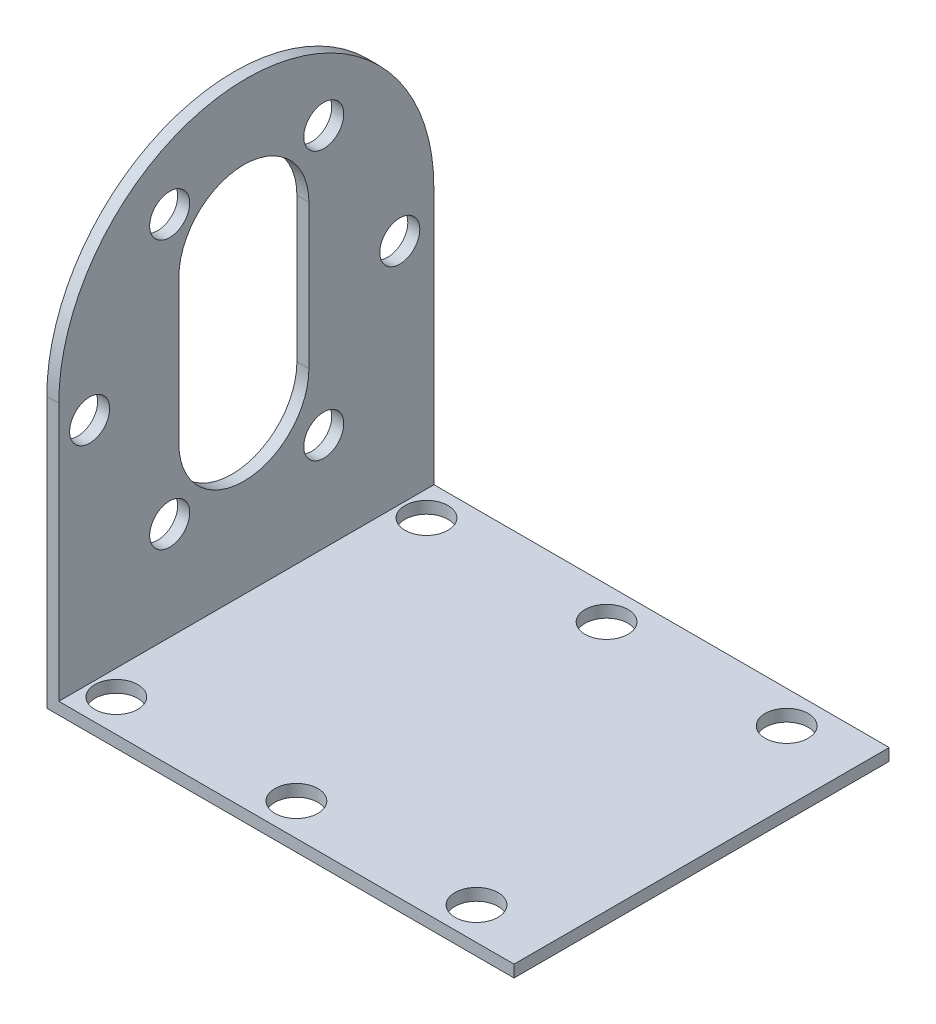
ISO-10303-21;
HEADER;
FILE_DESCRIPTION(('STEP AP214'),'2;1');
FILE_NAME('part.step','',(''),(''),'','','');
FILE_SCHEMA(('AUTOMOTIVE_DESIGN { 1 0 10303 214 1 1 1 1 }'));
ENDSEC;
DATA;
#1=APPLICATION_CONTEXT('core data for automotive mechanical design processes');
#2=APPLICATION_PROTOCOL_DEFINITION('international standard','automotive_design',2000,#1);
#3=PRODUCT_CONTEXT('',#1,'mechanical');
#4=PRODUCT('Part','Part','',(#3));
#5=PRODUCT_RELATED_PRODUCT_CATEGORY('part','',(#4));
#6=PRODUCT_DEFINITION_FORMATION('','',#4);
#7=PRODUCT_DEFINITION_CONTEXT('part definition',#1,'design');
#8=PRODUCT_DEFINITION('design','',#6,#7);
#9=PRODUCT_DEFINITION_SHAPE('','',#8);
#10=(LENGTH_UNIT() NAMED_UNIT(*) SI_UNIT(.MILLI.,.METRE.));
#11=(NAMED_UNIT(*) PLANE_ANGLE_UNIT() SI_UNIT($,.RADIAN.));
#12=(NAMED_UNIT(*) SI_UNIT($,.STERADIAN.) SOLID_ANGLE_UNIT());
#13=UNCERTAINTY_MEASURE_WITH_UNIT(LENGTH_MEASURE(1.E-05),#10,'distance_accuracy_value','');
#14=(GEOMETRIC_REPRESENTATION_CONTEXT(3) GLOBAL_UNCERTAINTY_ASSIGNED_CONTEXT((#13)) GLOBAL_UNIT_ASSIGNED_CONTEXT((#10,
#11,#12)) REPRESENTATION_CONTEXT('',''));
#15=CARTESIAN_POINT('',(0.,0.,0.));
#16=DIRECTION('',(0.,0.,1.));
#17=DIRECTION('',(1.,0.,0.));
#18=AXIS2_PLACEMENT_3D('',#15,#16,#17);
#19=CARTESIAN_POINT('',(0.,1.2,0.));
#20=DIRECTION('',(1.,0.,0.));
#21=DIRECTION('',(0.,0.,-1.));
#22=AXIS2_PLACEMENT_3D('',#19,#20,#21);
#23=PLANE('',#22);
#24=DIRECTION('',(0.,-1.,0.));
#25=VECTOR('',#24,1.);
#26=CARTESIAN_POINT('',(0.,0.,-37.481879160282));
#27=LINE('',#26,#25);
#28=CARTESIAN_POINT('',(0.,1.2,-37.481879160282));
#29=VERTEX_POINT('',#28);
#30=CARTESIAN_POINT('',(0.,0.,-37.481879160282));
#31=VERTEX_POINT('',#30);
#32=EDGE_CURVE('E11',#29,#31,#27,.T.);
#33=ORIENTED_EDGE('',*,*,#32,.F.);
#34=DIRECTION('',(0.,0.,1.));
#35=VECTOR('',#34,1.);
#36=CARTESIAN_POINT('',(0.,1.2,0.));
#37=LINE('',#36,#35);
#38=CARTESIAN_POINT('',(0.,1.2,-37.5));
#39=VERTEX_POINT('',#38);
#40=EDGE_CURVE('E111',#39,#29,#37,.T.);
#41=ORIENTED_EDGE('',*,*,#40,.F.);
#42=DIRECTION('',(0.,-1.,0.));
#43=VECTOR('',#42,1.);
#44=CARTESIAN_POINT('',(0.,1.2,-37.5));
#45=LINE('',#44,#43);
#46=CARTESIAN_POINT('',(0.,0.,-37.5));
#47=VERTEX_POINT('',#46);
#48=EDGE_CURVE('E168',#39,#47,#45,.T.);
#49=ORIENTED_EDGE('',*,*,#48,.T.);
#50=DIRECTION('',(0.,0.,1.));
#51=VECTOR('',#50,1.);
#52=CARTESIAN_POINT('',(0.,0.,0.));
#53=LINE('',#52,#51);
#54=EDGE_CURVE('E113',#47,#31,#53,.T.);
#55=ORIENTED_EDGE('',*,*,#54,.T.);
#56=EDGE_LOOP('',(#33,#41,#49,#55));
#57=FACE_BOUND('',#56,.T.);
#58=ADVANCED_FACE('F32',(#57),#23,.F.);
#59=CARTESIAN_POINT('',(0.,1.2,0.));
#60=DIRECTION('',(0.,-1.,0.));
#61=DIRECTION('',(0.,0.,-1.));
#62=AXIS2_PLACEMENT_3D('',#59,#60,#61);
#63=PLANE('',#62);
#64=ORIENTED_EDGE('',*,*,#40,.T.);
#65=CARTESIAN_POINT('',(0.,1.2,0.));
#66=VERTEX_POINT('',#65);
#67=EDGE_CURVE('E122',#29,#66,#37,.T.);
#68=ORIENTED_EDGE('',*,*,#67,.T.);
#69=DIRECTION('',(1.,0.,0.));
#70=VECTOR('',#69,1.);
#71=CARTESIAN_POINT('',(0.,1.2,0.));
#72=LINE('',#71,#70);
#73=CARTESIAN_POINT('',(45.5,1.2,0.));
#74=VERTEX_POINT('',#73);
#75=EDGE_CURVE('E126',#66,#74,#72,.T.);
#76=ORIENTED_EDGE('',*,*,#75,.T.);
#77=DIRECTION('',(0.,0.,-1.));
#78=VECTOR('',#77,1.);
#79=CARTESIAN_POINT('',(45.5,1.2,0.));
#80=LINE('',#79,#78);
#81=CARTESIAN_POINT('',(45.5,1.2,-37.5));
#82=VERTEX_POINT('',#81);
#83=EDGE_CURVE('E166',#74,#82,#80,.T.);
#84=ORIENTED_EDGE('',*,*,#83,.T.);
#85=DIRECTION('',(-1.,0.,0.));
#86=VECTOR('',#85,1.);
#87=CARTESIAN_POINT('',(0.,1.2,-37.5));
#88=LINE('',#87,#86);
#89=EDGE_CURVE('E124',#82,#39,#88,.T.);
#90=ORIENTED_EDGE('',*,*,#89,.T.);
#91=EDGE_LOOP('',(#64,#68,#76,#84,#90));
#92=FACE_BOUND('',#91,.T.);
#93=CARTESIAN_POINT('',(2.5,1.2,-34.25));
#94=DIRECTION('',(0.,1.,0.));
#95=DIRECTION('',(0.,0.,1.));
#96=AXIS2_PLACEMENT_3D('',#93,#94,#95);
#97=CIRCLE('',#96,2.15);
#98=CARTESIAN_POINT('',(2.5,1.2,-32.1));
#99=VERTEX_POINT('',#98);
#100=EDGE_CURVE('E388',#99,#99,#97,.T.);
#101=ORIENTED_EDGE('',*,*,#100,.F.);
#102=EDGE_LOOP('',(#101));
#103=FACE_BOUND('',#102,.T.);
#104=CARTESIAN_POINT('',(20.5,1.2,-34.25));
#105=DIRECTION('',(0.,1.,0.));
#106=DIRECTION('',(0.,0.,1.));
#107=AXIS2_PLACEMENT_3D('',#104,#105,#106);
#108=CIRCLE('',#107,2.15);
#109=CARTESIAN_POINT('',(20.5,1.2,-32.1));
#110=VERTEX_POINT('',#109);
#111=EDGE_CURVE('E384',#110,#110,#108,.T.);
#112=ORIENTED_EDGE('',*,*,#111,.F.);
#113=EDGE_LOOP('',(#112));
#114=FACE_BOUND('',#113,.T.);
#115=CARTESIAN_POINT('',(38.5,1.2,-34.25));
#116=DIRECTION('',(0.,1.,0.));
#117=DIRECTION('',(0.,0.,1.));
#118=AXIS2_PLACEMENT_3D('',#115,#116,#117);
#119=CIRCLE('',#118,2.15);
#120=CARTESIAN_POINT('',(38.5,1.2,-32.1));
#121=VERTEX_POINT('',#120);
#122=EDGE_CURVE('E378',#121,#121,#119,.T.);
#123=ORIENTED_EDGE('',*,*,#122,.F.);
#124=EDGE_LOOP('',(#123));
#125=FACE_BOUND('',#124,.T.);
#126=CARTESIAN_POINT('',(2.5,1.2,-3.25));
#127=DIRECTION('',(0.,1.,0.));
#128=DIRECTION('',(0.,0.,1.));
#129=AXIS2_PLACEMENT_3D('',#126,#127,#128);
#130=CIRCLE('',#129,2.15);
#131=CARTESIAN_POINT('',(2.5,1.2,-1.1));
#132=VERTEX_POINT('',#131);
#133=EDGE_CURVE('E372',#132,#132,#130,.T.);
#134=ORIENTED_EDGE('',*,*,#133,.F.);
#135=EDGE_LOOP('',(#134));
#136=FACE_BOUND('',#135,.T.);
#137=CARTESIAN_POINT('',(20.5,1.2,-3.25));
#138=DIRECTION('',(0.,1.,0.));
#139=DIRECTION('',(0.,0.,1.));
#140=AXIS2_PLACEMENT_3D('',#137,#138,#139);
#141=CIRCLE('',#140,2.15);
#142=CARTESIAN_POINT('',(20.5,1.2,-1.1));
#143=VERTEX_POINT('',#142);
#144=EDGE_CURVE('E366',#143,#143,#141,.T.);
#145=ORIENTED_EDGE('',*,*,#144,.F.);
#146=EDGE_LOOP('',(#145));
#147=FACE_BOUND('',#146,.T.);
#148=CARTESIAN_POINT('',(38.5,1.2,-3.25));
#149=DIRECTION('',(0.,1.,0.));
#150=DIRECTION('',(0.,0.,1.));
#151=AXIS2_PLACEMENT_3D('',#148,#149,#150);
#152=CIRCLE('',#151,2.15);
#153=CARTESIAN_POINT('',(38.5,1.2,-1.1));
#154=VERTEX_POINT('',#153);
#155=EDGE_CURVE('E359',#154,#154,#152,.T.);
#156=ORIENTED_EDGE('',*,*,#155,.F.);
#157=EDGE_LOOP('',(#156));
#158=FACE_BOUND('',#157,.T.);
#159=ADVANCED_FACE('F120',(#92,#103,#114,#125,#136,#147,#158),#63,.F.);
#160=CARTESIAN_POINT('',(0.,0.,0.));
#161=DIRECTION('',(0.,-1.,0.));
#162=DIRECTION('',(0.,0.,-1.));
#163=AXIS2_PLACEMENT_3D('',#160,#161,#162);
#164=PLANE('',#163);
#165=CARTESIAN_POINT('',(20.5,0.,-3.25));
#166=DIRECTION('',(0.,1.,0.));
#167=DIRECTION('',(0.,0.,1.));
#168=AXIS2_PLACEMENT_3D('',#165,#166,#167);
#169=CIRCLE('',#168,2.15);
#170=CARTESIAN_POINT('',(20.5,0.,-1.1));
#171=VERTEX_POINT('',#170);
#172=EDGE_CURVE('E362',#171,#171,#169,.T.);
#173=ORIENTED_EDGE('',*,*,#172,.T.);
#174=EDGE_LOOP('',(#173));
#175=FACE_BOUND('',#174,.T.);
#176=CARTESIAN_POINT('',(38.5,0.,-34.25));
#177=DIRECTION('',(0.,1.,0.));
#178=DIRECTION('',(0.,0.,1.));
#179=AXIS2_PLACEMENT_3D('',#176,#177,#178);
#180=CIRCLE('',#179,2.15);
#181=CARTESIAN_POINT('',(38.5,0.,-32.1));
#182=VERTEX_POINT('',#181);
#183=EDGE_CURVE('E375',#182,#182,#180,.T.);
#184=ORIENTED_EDGE('',*,*,#183,.T.);
#185=EDGE_LOOP('',(#184));
#186=FACE_BOUND('',#185,.T.);
#187=CARTESIAN_POINT('',(2.5,0.,-34.25));
#188=DIRECTION('',(0.,1.,0.));
#189=DIRECTION('',(0.,0.,1.));
#190=AXIS2_PLACEMENT_3D('',#187,#188,#189);
#191=CIRCLE('',#190,2.15);
#192=CARTESIAN_POINT('',(2.5,0.,-32.1));
#193=VERTEX_POINT('',#192);
#194=EDGE_CURVE('E164',#193,#193,#191,.T.);
#195=ORIENTED_EDGE('',*,*,#194,.T.);
#196=EDGE_LOOP('',(#195));
#197=FACE_BOUND('',#196,.T.);
#198=ORIENTED_EDGE('',*,*,#54,.F.);
#199=DIRECTION('',(-1.,0.,0.));
#200=VECTOR('',#199,1.);
#201=CARTESIAN_POINT('',(0.,0.,-37.5));
#202=LINE('',#201,#200);
#203=CARTESIAN_POINT('',(45.5,0.,-37.5));
#204=VERTEX_POINT('',#203);
#205=EDGE_CURVE('E133',#204,#47,#202,.T.);
#206=ORIENTED_EDGE('',*,*,#205,.F.);
#207=DIRECTION('',(0.,0.,-1.));
#208=VECTOR('',#207,1.);
#209=CARTESIAN_POINT('',(45.5,0.,0.));
#210=LINE('',#209,#208);
#211=CARTESIAN_POINT('',(45.5,0.,0.));
#212=VERTEX_POINT('',#211);
#213=EDGE_CURVE('E173',#212,#204,#210,.T.);
#214=ORIENTED_EDGE('',*,*,#213,.F.);
#215=DIRECTION('',(1.,0.,0.));
#216=VECTOR('',#215,1.);
#217=CARTESIAN_POINT('',(0.,0.,0.));
#218=LINE('',#217,#216);
#219=CARTESIAN_POINT('',(-1.2,0.,0.));
#220=VERTEX_POINT('',#219);
#221=EDGE_CURVE('E171',#220,#212,#218,.T.);
#222=ORIENTED_EDGE('',*,*,#221,.F.);
#223=DIRECTION('',(0.,0.,1.));
#224=VECTOR('',#223,1.);
#225=CARTESIAN_POINT('',(-1.2,0.,-37.481879160282));
#226=LINE('',#225,#224);
#227=CARTESIAN_POINT('',(-1.2,0.,-37.481879160282));
#228=VERTEX_POINT('',#227);
#229=EDGE_CURVE('E140',#228,#220,#226,.T.);
#230=ORIENTED_EDGE('',*,*,#229,.F.);
#231=DIRECTION('',(1.,0.,0.));
#232=VECTOR('',#231,1.);
#233=CARTESIAN_POINT('',(-1.2,0.,-37.481879160282));
#234=LINE('',#233,#232);
#235=EDGE_CURVE('E155',#228,#31,#234,.T.);
#236=ORIENTED_EDGE('',*,*,#235,.T.);
#237=EDGE_LOOP('',(#198,#206,#214,#222,#230,#236));
#238=FACE_BOUND('',#237,.T.);
#239=CARTESIAN_POINT('',(20.5,0.,-34.25));
#240=DIRECTION('',(0.,1.,0.));
#241=DIRECTION('',(0.,0.,1.));
#242=AXIS2_PLACEMENT_3D('',#239,#240,#241);
#243=CIRCLE('',#242,2.15);
#244=CARTESIAN_POINT('',(20.5,0.,-32.1));
#245=VERTEX_POINT('',#244);
#246=EDGE_CURVE('E381',#245,#245,#243,.T.);
#247=ORIENTED_EDGE('',*,*,#246,.T.);
#248=EDGE_LOOP('',(#247));
#249=FACE_BOUND('',#248,.T.);
#250=CARTESIAN_POINT('',(2.5,0.,-3.25));
#251=DIRECTION('',(0.,1.,0.));
#252=DIRECTION('',(0.,0.,1.));
#253=AXIS2_PLACEMENT_3D('',#250,#251,#252);
#254=CIRCLE('',#253,2.15);
#255=CARTESIAN_POINT('',(2.5,0.,-1.1));
#256=VERTEX_POINT('',#255);
#257=EDGE_CURVE('E369',#256,#256,#254,.T.);
#258=ORIENTED_EDGE('',*,*,#257,.T.);
#259=EDGE_LOOP('',(#258));
#260=FACE_BOUND('',#259,.T.);
#261=CARTESIAN_POINT('',(38.5,0.,-3.25));
#262=DIRECTION('',(0.,1.,0.));
#263=DIRECTION('',(0.,0.,1.));
#264=AXIS2_PLACEMENT_3D('',#261,#262,#263);
#265=CIRCLE('',#264,2.15);
#266=CARTESIAN_POINT('',(38.5,0.,-1.1));
#267=VERTEX_POINT('',#266);
#268=EDGE_CURVE('E363',#267,#267,#265,.T.);
#269=ORIENTED_EDGE('',*,*,#268,.T.);
#270=EDGE_LOOP('',(#269));
#271=FACE_BOUND('',#270,.T.);
#272=ADVANCED_FACE('F189',(#175,#186,#197,#238,#249,#260,#271),#164,.T.);
#273=CARTESIAN_POINT('',(0.,1.2,0.));
#274=DIRECTION('',(0.,0.,-1.));
#275=DIRECTION('',(-1.,0.,0.));
#276=AXIS2_PLACEMENT_3D('',#273,#274,#275);
#277=PLANE('',#276);
#278=ORIENTED_EDGE('',*,*,#221,.T.);
#279=DIRECTION('',(0.,-1.,0.));
#280=VECTOR('',#279,1.);
#281=CARTESIAN_POINT('',(45.5,1.2,0.));
#282=LINE('',#281,#280);
#283=EDGE_CURVE('E41',#74,#212,#282,.T.);
#284=ORIENTED_EDGE('',*,*,#283,.F.);
#285=ORIENTED_EDGE('',*,*,#75,.F.);
#286=DIRECTION('',(0.,1.,0.));
#287=VECTOR('',#286,1.);
#288=CARTESIAN_POINT('',(0.,0.,0.));
#289=LINE('',#288,#287);
#290=CARTESIAN_POINT('',(0.,27.,0.));
#291=VERTEX_POINT('',#290);
#292=EDGE_CURVE('E74',#66,#291,#289,.T.);
#293=ORIENTED_EDGE('',*,*,#292,.T.);
#294=DIRECTION('',(1.,0.,0.));
#295=VECTOR('',#294,1.);
#296=CARTESIAN_POINT('',(-1.2,27.,0.));
#297=LINE('',#296,#295);
#298=CARTESIAN_POINT('',(-1.2,27.,0.));
#299=VERTEX_POINT('',#298);
#300=EDGE_CURVE('E358',#299,#291,#297,.T.);
#301=ORIENTED_EDGE('',*,*,#300,.F.);
#302=DIRECTION('',(0.,1.,0.));
#303=VECTOR('',#302,1.);
#304=CARTESIAN_POINT('',(-1.2,0.,0.));
#305=LINE('',#304,#303);
#306=EDGE_CURVE('E144',#220,#299,#305,.T.);
#307=ORIENTED_EDGE('',*,*,#306,.F.);
#308=EDGE_LOOP('',(#278,#284,#285,#293,#301,#307));
#309=FACE_BOUND('',#308,.T.);
#310=ADVANCED_FACE('F205',(#309),#277,.F.);
#311=CARTESIAN_POINT('',(45.5,1.2,0.));
#312=DIRECTION('',(-1.,0.,0.));
#313=DIRECTION('',(0.,0.,1.));
#314=AXIS2_PLACEMENT_3D('',#311,#312,#313);
#315=PLANE('',#314);
#316=ORIENTED_EDGE('',*,*,#213,.T.);
#317=DIRECTION('',(0.,-1.,0.));
#318=VECTOR('',#317,1.);
#319=CARTESIAN_POINT('',(45.5,1.2,-37.5));
#320=LINE('',#319,#318);
#321=EDGE_CURVE('E177',#82,#204,#320,.T.);
#322=ORIENTED_EDGE('',*,*,#321,.F.);
#323=ORIENTED_EDGE('',*,*,#83,.F.);
#324=ORIENTED_EDGE('',*,*,#283,.T.);
#325=EDGE_LOOP('',(#316,#322,#323,#324));
#326=FACE_BOUND('',#325,.T.);
#327=ADVANCED_FACE('F184',(#326),#315,.F.);
#328=CARTESIAN_POINT('',(0.,1.2,-37.5));
#329=DIRECTION('',(0.,0.,1.));
#330=DIRECTION('',(1.,0.,0.));
#331=AXIS2_PLACEMENT_3D('',#328,#329,#330);
#332=PLANE('',#331);
#333=ORIENTED_EDGE('',*,*,#205,.T.);
#334=ORIENTED_EDGE('',*,*,#48,.F.);
#335=ORIENTED_EDGE('',*,*,#89,.F.);
#336=ORIENTED_EDGE('',*,*,#321,.T.);
#337=EDGE_LOOP('',(#333,#334,#335,#336));
#338=FACE_BOUND('',#337,.T.);
#339=ADVANCED_FACE('F194',(#338),#332,.F.);
#340=CARTESIAN_POINT('',(2.5,1.2,-34.25));
#341=DIRECTION('',(0.,-1.,0.));
#342=DIRECTION('',(0.,0.,-1.));
#343=AXIS2_PLACEMENT_3D('',#340,#341,#342);
#344=CYLINDRICAL_SURFACE('',#343,2.15);
#345=ORIENTED_EDGE('',*,*,#100,.T.);
#346=EDGE_LOOP('',(#345));
#347=FACE_BOUND('',#346,.T.);
#348=ORIENTED_EDGE('',*,*,#194,.F.);
#349=EDGE_LOOP('',(#348));
#350=FACE_BOUND('',#349,.T.);
#351=ADVANCED_FACE('F196',(#347,#350),#344,.F.);
#352=CARTESIAN_POINT('',(20.5,1.2,-34.25));
#353=DIRECTION('',(0.,-1.,0.));
#354=DIRECTION('',(0.,0.,-1.));
#355=AXIS2_PLACEMENT_3D('',#352,#353,#354);
#356=CYLINDRICAL_SURFACE('',#355,2.15);
#357=ORIENTED_EDGE('',*,*,#111,.T.);
#358=EDGE_LOOP('',(#357));
#359=FACE_BOUND('',#358,.T.);
#360=ORIENTED_EDGE('',*,*,#246,.F.);
#361=EDGE_LOOP('',(#360));
#362=FACE_BOUND('',#361,.T.);
#363=ADVANCED_FACE('F202',(#359,#362),#356,.F.);
#364=CARTESIAN_POINT('',(38.5,1.2,-34.25));
#365=DIRECTION('',(0.,-1.,0.));
#366=DIRECTION('',(0.,0.,-1.));
#367=AXIS2_PLACEMENT_3D('',#364,#365,#366);
#368=CYLINDRICAL_SURFACE('',#367,2.15);
#369=ORIENTED_EDGE('',*,*,#122,.T.);
#370=EDGE_LOOP('',(#369));
#371=FACE_BOUND('',#370,.T.);
#372=ORIENTED_EDGE('',*,*,#183,.F.);
#373=EDGE_LOOP('',(#372));
#374=FACE_BOUND('',#373,.T.);
#375=ADVANCED_FACE('F220',(#371,#374),#368,.F.);
#376=CARTESIAN_POINT('',(2.5,1.2,-3.25));
#377=DIRECTION('',(0.,-1.,0.));
#378=DIRECTION('',(0.,0.,-1.));
#379=AXIS2_PLACEMENT_3D('',#376,#377,#378);
#380=CYLINDRICAL_SURFACE('',#379,2.15);
#381=ORIENTED_EDGE('',*,*,#133,.T.);
#382=EDGE_LOOP('',(#381));
#383=FACE_BOUND('',#382,.T.);
#384=ORIENTED_EDGE('',*,*,#257,.F.);
#385=EDGE_LOOP('',(#384));
#386=FACE_BOUND('',#385,.T.);
#387=ADVANCED_FACE('F224',(#383,#386),#380,.F.);
#388=CARTESIAN_POINT('',(20.5,1.2,-3.25));
#389=DIRECTION('',(0.,-1.,0.));
#390=DIRECTION('',(0.,0.,-1.));
#391=AXIS2_PLACEMENT_3D('',#388,#389,#390);
#392=CYLINDRICAL_SURFACE('',#391,2.15);
#393=ORIENTED_EDGE('',*,*,#144,.T.);
#394=EDGE_LOOP('',(#393));
#395=FACE_BOUND('',#394,.T.);
#396=ORIENTED_EDGE('',*,*,#172,.F.);
#397=EDGE_LOOP('',(#396));
#398=FACE_BOUND('',#397,.T.);
#399=ADVANCED_FACE('F228',(#395,#398),#392,.F.);
#400=CARTESIAN_POINT('',(38.5,1.2,-3.25));
#401=DIRECTION('',(0.,-1.,0.));
#402=DIRECTION('',(0.,0.,-1.));
#403=AXIS2_PLACEMENT_3D('',#400,#401,#402);
#404=CYLINDRICAL_SURFACE('',#403,2.15);
#405=ORIENTED_EDGE('',*,*,#155,.T.);
#406=EDGE_LOOP('',(#405));
#407=FACE_BOUND('',#406,.T.);
#408=ORIENTED_EDGE('',*,*,#268,.F.);
#409=EDGE_LOOP('',(#408));
#410=FACE_BOUND('',#409,.T.);
#411=ADVANCED_FACE('F232',(#407,#410),#404,.F.);
#412=CARTESIAN_POINT('',(-1.2,27.,-18.740939580141));
#413=DIRECTION('',(1.,0.,0.));
#414=DIRECTION('',(0.,0.,-1.));
#415=AXIS2_PLACEMENT_3D('',#412,#413,#414);
#416=CYLINDRICAL_SURFACE('',#415,18.740939580141);
#417=CARTESIAN_POINT('',(0.,27.,-18.740939580141));
#418=DIRECTION('',(-1.,0.,0.));
#419=DIRECTION('',(0.,0.,1.));
#420=AXIS2_PLACEMENT_3D('',#417,#418,#419);
#421=CIRCLE('',#420,18.740939580141);
#422=CARTESIAN_POINT('',(0.,27.,-37.481879160282));
#423=VERTEX_POINT('',#422);
#424=EDGE_CURVE('E141',#291,#423,#421,.T.);
#425=ORIENTED_EDGE('',*,*,#424,.T.);
#426=DIRECTION('',(1.,0.,0.));
#427=VECTOR('',#426,1.);
#428=CARTESIAN_POINT('',(-1.2,27.,-37.481879160282));
#429=LINE('',#428,#427);
#430=CARTESIAN_POINT('',(-1.2,27.,-37.481879160282));
#431=VERTEX_POINT('',#430);
#432=EDGE_CURVE('E139',#431,#423,#429,.T.);
#433=ORIENTED_EDGE('',*,*,#432,.F.);
#434=CARTESIAN_POINT('',(-1.2,27.,-18.740939580141));
#435=DIRECTION('',(-1.,0.,0.));
#436=DIRECTION('',(0.,0.,1.));
#437=AXIS2_PLACEMENT_3D('',#434,#435,#436);
#438=CIRCLE('',#437,18.740939580141);
#439=EDGE_CURVE('E351',#299,#431,#438,.T.);
#440=ORIENTED_EDGE('',*,*,#439,.F.);
#441=ORIENTED_EDGE('',*,*,#300,.T.);
#442=EDGE_LOOP('',(#425,#433,#440,#441));
#443=FACE_BOUND('',#442,.T.);
#444=ADVANCED_FACE('F236',(#443),#416,.T.);
#445=CARTESIAN_POINT('',(-1.2,0.,-37.481879160282));
#446=DIRECTION('',(0.,0.,1.));
#447=DIRECTION('',(1.,0.,0.));
#448=AXIS2_PLACEMENT_3D('',#445,#446,#447);
#449=PLANE('',#448);
#450=EDGE_CURVE('E132',#423,#29,#27,.T.);
#451=ORIENTED_EDGE('',*,*,#450,.T.);
#452=ORIENTED_EDGE('',*,*,#32,.T.);
#453=ORIENTED_EDGE('',*,*,#235,.F.);
#454=DIRECTION('',(0.,-1.,0.));
#455=VECTOR('',#454,1.);
#456=CARTESIAN_POINT('',(-1.2,0.,-37.481879160282));
#457=LINE('',#456,#455);
#458=EDGE_CURVE('E157',#431,#228,#457,.T.);
#459=ORIENTED_EDGE('',*,*,#458,.F.);
#460=ORIENTED_EDGE('',*,*,#432,.T.);
#461=EDGE_LOOP('',(#451,#452,#453,#459,#460));
#462=FACE_BOUND('',#461,.T.);
#463=ADVANCED_FACE('F136',(#462),#449,.F.);
#464=CARTESIAN_POINT('',(-1.2,27.,-18.740939580141));
#465=DIRECTION('',(-1.,0.,0.));
#466=DIRECTION('',(0.,0.,1.));
#467=AXIS2_PLACEMENT_3D('',#464,#465,#466);
#468=PLANE('',#467);
#469=CARTESIAN_POINT('',(-1.2,24.,-3.081879160282));
#470=DIRECTION('',(-1.,0.,0.));
#471=DIRECTION('',(0.,0.,1.));
#472=AXIS2_PLACEMENT_3D('',#469,#470,#471);
#473=CIRCLE('',#472,2.);
#474=CARTESIAN_POINT('',(-1.2,24.,-1.081879160282));
#475=VERTEX_POINT('',#474);
#476=EDGE_CURVE('E292',#475,#475,#473,.T.);
#477=ORIENTED_EDGE('',*,*,#476,.F.);
#478=EDGE_LOOP('',(#477));
#479=FACE_BOUND('',#478,.T.);
#480=CARTESIAN_POINT('',(-1.2,24.,-34.081879160282));
#481=DIRECTION('',(-1.,0.,0.));
#482=DIRECTION('',(0.,0.,1.));
#483=AXIS2_PLACEMENT_3D('',#480,#481,#482);
#484=CIRCLE('',#483,2.);
#485=CARTESIAN_POINT('',(-1.2,24.,-32.081879160282));
#486=VERTEX_POINT('',#485);
#487=EDGE_CURVE('E302',#486,#486,#484,.T.);
#488=ORIENTED_EDGE('',*,*,#487,.F.);
#489=EDGE_LOOP('',(#488));
#490=FACE_BOUND('',#489,.T.);
#491=CARTESIAN_POINT('',(-1.2,37.8,-11.081879160282));
#492=DIRECTION('',(-1.,0.,0.));
#493=DIRECTION('',(0.,0.,1.));
#494=AXIS2_PLACEMENT_3D('',#491,#492,#493);
#495=CIRCLE('',#494,2.);
#496=CARTESIAN_POINT('',(-1.2,37.8,-9.081879160282));
#497=VERTEX_POINT('',#496);
#498=EDGE_CURVE('E308',#497,#497,#495,.T.);
#499=ORIENTED_EDGE('',*,*,#498,.F.);
#500=EDGE_LOOP('',(#499));
#501=FACE_BOUND('',#500,.T.);
#502=CARTESIAN_POINT('',(-1.2,11.,-11.081879160282));
#503=DIRECTION('',(-1.,0.,0.));
#504=DIRECTION('',(0.,0.,1.));
#505=AXIS2_PLACEMENT_3D('',#502,#503,#504);
#506=CIRCLE('',#505,2.);
#507=CARTESIAN_POINT('',(-1.2,11.,-9.081879160282));
#508=VERTEX_POINT('',#507);
#509=EDGE_CURVE('E314',#508,#508,#506,.T.);
#510=ORIENTED_EDGE('',*,*,#509,.F.);
#511=EDGE_LOOP('',(#510));
#512=FACE_BOUND('',#511,.T.);
#513=CARTESIAN_POINT('',(-1.2,37.8,-26.481879160282));
#514=DIRECTION('',(-1.,0.,0.));
#515=DIRECTION('',(0.,0.,1.));
#516=AXIS2_PLACEMENT_3D('',#513,#514,#515);
#517=CIRCLE('',#516,2.);
#518=CARTESIAN_POINT('',(-1.2,37.8,-24.481879160282));
#519=VERTEX_POINT('',#518);
#520=EDGE_CURVE('E320',#519,#519,#517,.T.);
#521=ORIENTED_EDGE('',*,*,#520,.F.);
#522=EDGE_LOOP('',(#521));
#523=FACE_BOUND('',#522,.T.);
#524=CARTESIAN_POINT('',(-1.2,11.,-26.481879160282));
#525=DIRECTION('',(-1.,0.,0.));
#526=DIRECTION('',(0.,0.,1.));
#527=AXIS2_PLACEMENT_3D('',#524,#525,#526);
#528=CIRCLE('',#527,2.);
#529=CARTESIAN_POINT('',(-1.2,11.,-24.481879160282));
#530=VERTEX_POINT('',#529);
#531=EDGE_CURVE('E326',#530,#530,#528,.T.);
#532=ORIENTED_EDGE('',*,*,#531,.F.);
#533=EDGE_LOOP('',(#532));
#534=FACE_BOUND('',#533,.T.);
#535=CARTESIAN_POINT('',(-1.2,31.9,-18.5));
#536=DIRECTION('',(1.,0.,0.));
#537=DIRECTION('',(0.,0.,-1.));
#538=AXIS2_PLACEMENT_3D('',#535,#536,#537);
#539=CIRCLE('',#538,6.50000000000001);
#540=CARTESIAN_POINT('',(-1.2,31.9,-25.));
#541=VERTEX_POINT('',#540);
#542=CARTESIAN_POINT('',(-1.2,31.9,-12.));
#543=VERTEX_POINT('',#542);
#544=EDGE_CURVE('E35',#541,#543,#539,.T.);
#545=ORIENTED_EDGE('',*,*,#544,.T.);
#546=DIRECTION('',(0.,1.,0.));
#547=VECTOR('',#546,1.);
#548=CARTESIAN_POINT('',(-1.2,27.,-12.));
#549=LINE('',#548,#547);
#550=CARTESIAN_POINT('',(-1.2,17.5,-12.));
#551=VERTEX_POINT('',#550);
#552=EDGE_CURVE('E347',#543,#551,#549,.F.);
#553=ORIENTED_EDGE('',*,*,#552,.T.);
#554=CARTESIAN_POINT('',(-1.2,17.5,-18.5));
#555=DIRECTION('',(1.,0.,0.));
#556=DIRECTION('',(0.,0.,-1.));
#557=AXIS2_PLACEMENT_3D('',#554,#555,#556);
#558=CIRCLE('',#557,6.50000000000001);
#559=CARTESIAN_POINT('',(-1.2,17.5,-25.));
#560=VERTEX_POINT('',#559);
#561=EDGE_CURVE('E50',#551,#560,#558,.T.);
#562=ORIENTED_EDGE('',*,*,#561,.T.);
#563=DIRECTION('',(0.,1.,0.));
#564=VECTOR('',#563,1.);
#565=CARTESIAN_POINT('',(-1.2,27.,-25.));
#566=LINE('',#565,#564);
#567=EDGE_CURVE('E439',#560,#541,#566,.T.);
#568=ORIENTED_EDGE('',*,*,#567,.T.);
#569=EDGE_LOOP('',(#545,#553,#562,#568));
#570=FACE_BOUND('',#569,.T.);
#571=ORIENTED_EDGE('',*,*,#229,.T.);
#572=ORIENTED_EDGE('',*,*,#306,.T.);
#573=ORIENTED_EDGE('',*,*,#439,.T.);
#574=ORIENTED_EDGE('',*,*,#458,.T.);
#575=EDGE_LOOP('',(#571,#572,#573,#574));
#576=FACE_BOUND('',#575,.T.);
#577=ADVANCED_FACE('F243',(#479,#490,#501,#512,#523,#534,#570,#576),#468,.T.);
#578=CARTESIAN_POINT('',(0.,27.,-18.740939580141));
#579=DIRECTION('',(-1.,0.,0.));
#580=DIRECTION('',(0.,0.,1.));
#581=AXIS2_PLACEMENT_3D('',#578,#579,#580);
#582=PLANE('',#581);
#583=CARTESIAN_POINT('',(0.,24.,-3.081879160282));
#584=DIRECTION('',(1.,0.,0.));
#585=DIRECTION('',(0.,0.,-1.));
#586=AXIS2_PLACEMENT_3D('',#583,#584,#585);
#587=CIRCLE('',#586,2.);
#588=CARTESIAN_POINT('',(0.,24.,-5.08187916028201));
#589=VERTEX_POINT('',#588);
#590=EDGE_CURVE('E295',#589,#589,#587,.T.);
#591=ORIENTED_EDGE('',*,*,#590,.F.);
#592=EDGE_LOOP('',(#591));
#593=FACE_BOUND('',#592,.T.);
#594=CARTESIAN_POINT('',(0.,24.,-34.081879160282));
#595=DIRECTION('',(1.,0.,0.));
#596=DIRECTION('',(0.,0.,-1.));
#597=AXIS2_PLACEMENT_3D('',#594,#595,#596);
#598=CIRCLE('',#597,2.);
#599=CARTESIAN_POINT('',(0.,24.,-36.081879160282));
#600=VERTEX_POINT('',#599);
#601=EDGE_CURVE('E297',#600,#600,#598,.T.);
#602=ORIENTED_EDGE('',*,*,#601,.F.);
#603=EDGE_LOOP('',(#602));
#604=FACE_BOUND('',#603,.T.);
#605=CARTESIAN_POINT('',(0.,37.8,-11.081879160282));
#606=DIRECTION('',(1.,0.,0.));
#607=DIRECTION('',(0.,0.,-1.));
#608=AXIS2_PLACEMENT_3D('',#605,#606,#607);
#609=CIRCLE('',#608,2.);
#610=CARTESIAN_POINT('',(0.,37.8,-13.081879160282));
#611=VERTEX_POINT('',#610);
#612=EDGE_CURVE('E305',#611,#611,#609,.T.);
#613=ORIENTED_EDGE('',*,*,#612,.F.);
#614=EDGE_LOOP('',(#613));
#615=FACE_BOUND('',#614,.T.);
#616=CARTESIAN_POINT('',(0.,11.,-11.081879160282));
#617=DIRECTION('',(1.,0.,0.));
#618=DIRECTION('',(0.,0.,-1.));
#619=AXIS2_PLACEMENT_3D('',#616,#617,#618);
#620=CIRCLE('',#619,2.);
#621=CARTESIAN_POINT('',(0.,11.,-13.081879160282));
#622=VERTEX_POINT('',#621);
#623=EDGE_CURVE('E311',#622,#622,#620,.T.);
#624=ORIENTED_EDGE('',*,*,#623,.F.);
#625=EDGE_LOOP('',(#624));
#626=FACE_BOUND('',#625,.T.);
#627=CARTESIAN_POINT('',(0.,37.8,-26.481879160282));
#628=DIRECTION('',(1.,0.,0.));
#629=DIRECTION('',(0.,0.,-1.));
#630=AXIS2_PLACEMENT_3D('',#627,#628,#629);
#631=CIRCLE('',#630,2.);
#632=CARTESIAN_POINT('',(0.,37.8,-28.481879160282));
#633=VERTEX_POINT('',#632);
#634=EDGE_CURVE('E317',#633,#633,#631,.T.);
#635=ORIENTED_EDGE('',*,*,#634,.F.);
#636=EDGE_LOOP('',(#635));
#637=FACE_BOUND('',#636,.T.);
#638=CARTESIAN_POINT('',(0.,11.,-26.481879160282));
#639=DIRECTION('',(1.,0.,0.));
#640=DIRECTION('',(0.,0.,-1.));
#641=AXIS2_PLACEMENT_3D('',#638,#639,#640);
#642=CIRCLE('',#641,2.);
#643=CARTESIAN_POINT('',(0.,11.,-28.481879160282));
#644=VERTEX_POINT('',#643);
#645=EDGE_CURVE('E323',#644,#644,#642,.T.);
#646=ORIENTED_EDGE('',*,*,#645,.F.);
#647=EDGE_LOOP('',(#646));
#648=FACE_BOUND('',#647,.T.);
#649=DIRECTION('',(0.,-1.,0.));
#650=VECTOR('',#649,1.);
#651=CARTESIAN_POINT('',(0.,31.9,-12.));
#652=LINE('',#651,#650);
#653=CARTESIAN_POINT('',(0.,31.9,-12.));
#654=VERTEX_POINT('',#653);
#655=CARTESIAN_POINT('',(0.,17.5,-12.));
#656=VERTEX_POINT('',#655);
#657=EDGE_CURVE('E331',#654,#656,#652,.T.);
#658=ORIENTED_EDGE('',*,*,#657,.F.);
#659=CARTESIAN_POINT('',(0.,31.9,-18.5));
#660=DIRECTION('',(1.,0.,0.));
#661=DIRECTION('',(0.,0.,-1.));
#662=AXIS2_PLACEMENT_3D('',#659,#660,#661);
#663=CIRCLE('',#662,6.50000000000001);
#664=CARTESIAN_POINT('',(0.,31.9,-25.));
#665=VERTEX_POINT('',#664);
#666=EDGE_CURVE('E329',#665,#654,#663,.T.);
#667=ORIENTED_EDGE('',*,*,#666,.F.);
#668=DIRECTION('',(0.,1.,0.));
#669=VECTOR('',#668,1.);
#670=CARTESIAN_POINT('',(0.,31.9,-25.));
#671=LINE('',#670,#669);
#672=CARTESIAN_POINT('',(0.,17.5,-25.));
#673=VERTEX_POINT('',#672);
#674=EDGE_CURVE('E337',#673,#665,#671,.T.);
#675=ORIENTED_EDGE('',*,*,#674,.F.);
#676=CARTESIAN_POINT('',(0.,17.5,-18.5));
#677=DIRECTION('',(1.,0.,0.));
#678=DIRECTION('',(0.,0.,-1.));
#679=AXIS2_PLACEMENT_3D('',#676,#677,#678);
#680=CIRCLE('',#679,6.50000000000001);
#681=EDGE_CURVE('E334',#656,#673,#680,.T.);
#682=ORIENTED_EDGE('',*,*,#681,.F.);
#683=EDGE_LOOP('',(#658,#667,#675,#682));
#684=FACE_BOUND('',#683,.T.);
#685=ORIENTED_EDGE('',*,*,#67,.F.);
#686=ORIENTED_EDGE('',*,*,#450,.F.);
#687=ORIENTED_EDGE('',*,*,#424,.F.);
#688=ORIENTED_EDGE('',*,*,#292,.F.);
#689=EDGE_LOOP('',(#685,#686,#687,#688));
#690=FACE_BOUND('',#689,.T.);
#691=ADVANCED_FACE('F130',(#593,#604,#615,#626,#637,#648,#684,#690),#582,.F.);
#692=CARTESIAN_POINT('',(-1.200025,31.9,-18.5));
#693=DIRECTION('',(1.,0.,0.));
#694=DIRECTION('',(0.,0.,-1.));
#695=AXIS2_PLACEMENT_3D('',#692,#693,#694);
#696=CYLINDRICAL_SURFACE('',#695,6.50000000000001);
#697=ORIENTED_EDGE('',*,*,#544,.F.);
#698=DIRECTION('',(1.,0.,0.));
#699=VECTOR('',#698,1.);
#700=CARTESIAN_POINT('',(-1.200025,31.9,-25.));
#701=LINE('',#700,#699);
#702=EDGE_CURVE('E65',#541,#665,#701,.T.);
#703=ORIENTED_EDGE('',*,*,#702,.T.);
#704=ORIENTED_EDGE('',*,*,#666,.T.);
#705=DIRECTION('',(1.,0.,0.));
#706=VECTOR('',#705,1.);
#707=CARTESIAN_POINT('',(-1.200025,31.9,-12.));
#708=LINE('',#707,#706);
#709=EDGE_CURVE('E339',#543,#654,#708,.T.);
#710=ORIENTED_EDGE('',*,*,#709,.F.);
#711=EDGE_LOOP('',(#697,#703,#704,#710));
#712=FACE_BOUND('',#711,.T.);
#713=ADVANCED_FACE('F246',(#712),#696,.F.);
#714=CARTESIAN_POINT('',(-1.200025,31.9,-25.));
#715=DIRECTION('',(0.,0.,-1.));
#716=DIRECTION('',(-1.,0.,0.));
#717=AXIS2_PLACEMENT_3D('',#714,#715,#716);
#718=PLANE('',#717);
#719=ORIENTED_EDGE('',*,*,#567,.F.);
#720=DIRECTION('',(1.,0.,0.));
#721=VECTOR('',#720,1.);
#722=CARTESIAN_POINT('',(-1.200025,17.5,-25.));
#723=LINE('',#722,#721);
#724=EDGE_CURVE('E344',#560,#673,#723,.T.);
#725=ORIENTED_EDGE('',*,*,#724,.T.);
#726=ORIENTED_EDGE('',*,*,#674,.T.);
#727=ORIENTED_EDGE('',*,*,#702,.F.);
#728=EDGE_LOOP('',(#719,#725,#726,#727));
#729=FACE_BOUND('',#728,.T.);
#730=ADVANCED_FACE('F253',(#729),#718,.F.);
#731=CARTESIAN_POINT('',(-1.200025,17.5,-18.5));
#732=DIRECTION('',(1.,0.,0.));
#733=DIRECTION('',(0.,0.,-1.));
#734=AXIS2_PLACEMENT_3D('',#731,#732,#733);
#735=CYLINDRICAL_SURFACE('',#734,6.50000000000001);
#736=ORIENTED_EDGE('',*,*,#561,.F.);
#737=DIRECTION('',(1.,0.,0.));
#738=VECTOR('',#737,1.);
#739=CARTESIAN_POINT('',(-1.200025,17.5,-12.));
#740=LINE('',#739,#738);
#741=EDGE_CURVE('E342',#551,#656,#740,.T.);
#742=ORIENTED_EDGE('',*,*,#741,.T.);
#743=ORIENTED_EDGE('',*,*,#681,.T.);
#744=ORIENTED_EDGE('',*,*,#724,.F.);
#745=EDGE_LOOP('',(#736,#742,#743,#744));
#746=FACE_BOUND('',#745,.T.);
#747=ADVANCED_FACE('F259',(#746),#735,.F.);
#748=CARTESIAN_POINT('',(-1.200025,31.9,-12.));
#749=DIRECTION('',(0.,0.,1.));
#750=DIRECTION('',(0.,-1.,0.));
#751=AXIS2_PLACEMENT_3D('',#748,#749,#750);
#752=PLANE('',#751);
#753=ORIENTED_EDGE('',*,*,#552,.F.);
#754=ORIENTED_EDGE('',*,*,#709,.T.);
#755=ORIENTED_EDGE('',*,*,#657,.T.);
#756=ORIENTED_EDGE('',*,*,#741,.F.);
#757=EDGE_LOOP('',(#753,#754,#755,#756));
#758=FACE_BOUND('',#757,.T.);
#759=ADVANCED_FACE('F255',(#758),#752,.F.);
#760=CARTESIAN_POINT('',(-1.200025,11.,-26.481879160282));
#761=DIRECTION('',(1.,0.,0.));
#762=DIRECTION('',(0.,0.,-1.));
#763=AXIS2_PLACEMENT_3D('',#760,#761,#762);
#764=CYLINDRICAL_SURFACE('',#763,2.);
#765=ORIENTED_EDGE('',*,*,#531,.T.);
#766=EDGE_LOOP('',(#765));
#767=FACE_BOUND('',#766,.T.);
#768=ORIENTED_EDGE('',*,*,#645,.T.);
#769=EDGE_LOOP('',(#768));
#770=FACE_BOUND('',#769,.T.);
#771=ADVANCED_FACE('F258',(#767,#770),#764,.F.);
#772=CARTESIAN_POINT('',(-1.200025,37.8,-26.481879160282));
#773=DIRECTION('',(1.,0.,0.));
#774=DIRECTION('',(0.,0.,-1.));
#775=AXIS2_PLACEMENT_3D('',#772,#773,#774);
#776=CYLINDRICAL_SURFACE('',#775,2.);
#777=ORIENTED_EDGE('',*,*,#520,.T.);
#778=EDGE_LOOP('',(#777));
#779=FACE_BOUND('',#778,.T.);
#780=ORIENTED_EDGE('',*,*,#634,.T.);
#781=EDGE_LOOP('',(#780));
#782=FACE_BOUND('',#781,.T.);
#783=ADVANCED_FACE('F267',(#779,#782),#776,.F.);
#784=CARTESIAN_POINT('',(-1.200025,11.,-11.081879160282));
#785=DIRECTION('',(1.,0.,0.));
#786=DIRECTION('',(0.,0.,-1.));
#787=AXIS2_PLACEMENT_3D('',#784,#785,#786);
#788=CYLINDRICAL_SURFACE('',#787,2.);
#789=ORIENTED_EDGE('',*,*,#509,.T.);
#790=EDGE_LOOP('',(#789));
#791=FACE_BOUND('',#790,.T.);
#792=ORIENTED_EDGE('',*,*,#623,.T.);
#793=EDGE_LOOP('',(#792));
#794=FACE_BOUND('',#793,.T.);
#795=ADVANCED_FACE('F271',(#791,#794),#788,.F.);
#796=CARTESIAN_POINT('',(-1.200025,37.8,-11.081879160282));
#797=DIRECTION('',(1.,0.,0.));
#798=DIRECTION('',(0.,0.,-1.));
#799=AXIS2_PLACEMENT_3D('',#796,#797,#798);
#800=CYLINDRICAL_SURFACE('',#799,2.);
#801=ORIENTED_EDGE('',*,*,#498,.T.);
#802=EDGE_LOOP('',(#801));
#803=FACE_BOUND('',#802,.T.);
#804=ORIENTED_EDGE('',*,*,#612,.T.);
#805=EDGE_LOOP('',(#804));
#806=FACE_BOUND('',#805,.T.);
#807=ADVANCED_FACE('F275',(#803,#806),#800,.F.);
#808=CARTESIAN_POINT('',(-1.200025,24.,-34.081879160282));
#809=DIRECTION('',(1.,0.,0.));
#810=DIRECTION('',(0.,0.,-1.));
#811=AXIS2_PLACEMENT_3D('',#808,#809,#810);
#812=CYLINDRICAL_SURFACE('',#811,2.);
#813=ORIENTED_EDGE('',*,*,#487,.T.);
#814=EDGE_LOOP('',(#813));
#815=FACE_BOUND('',#814,.T.);
#816=ORIENTED_EDGE('',*,*,#601,.T.);
#817=EDGE_LOOP('',(#816));
#818=FACE_BOUND('',#817,.T.);
#819=ADVANCED_FACE('F279',(#815,#818),#812,.F.);
#820=CARTESIAN_POINT('',(-1.200025,24.,-3.081879160282));
#821=DIRECTION('',(1.,0.,0.));
#822=DIRECTION('',(0.,0.,-1.));
#823=AXIS2_PLACEMENT_3D('',#820,#821,#822);
#824=CYLINDRICAL_SURFACE('',#823,2.);
#825=ORIENTED_EDGE('',*,*,#476,.T.);
#826=EDGE_LOOP('',(#825));
#827=FACE_BOUND('',#826,.T.);
#828=ORIENTED_EDGE('',*,*,#590,.T.);
#829=EDGE_LOOP('',(#828));
#830=FACE_BOUND('',#829,.T.);
#831=ADVANCED_FACE('F283',(#827,#830),#824,.F.);
#832=CLOSED_SHELL('',(#58,#159,#272,#310,#327,#339,#351,#363,#375,#387,#399,#411,#444,#463,#577,
#691,#713,#730,#747,#759,#771,#783,#795,#807,#819,#831));
#833=MANIFOLD_SOLID_BREP('B2',#832);
#834=ADVANCED_BREP_SHAPE_REPRESENTATION('',(#18,#833),#14);
#835=SHAPE_DEFINITION_REPRESENTATION(#9,#834);
ENDSEC;
END-ISO-10303-21;
